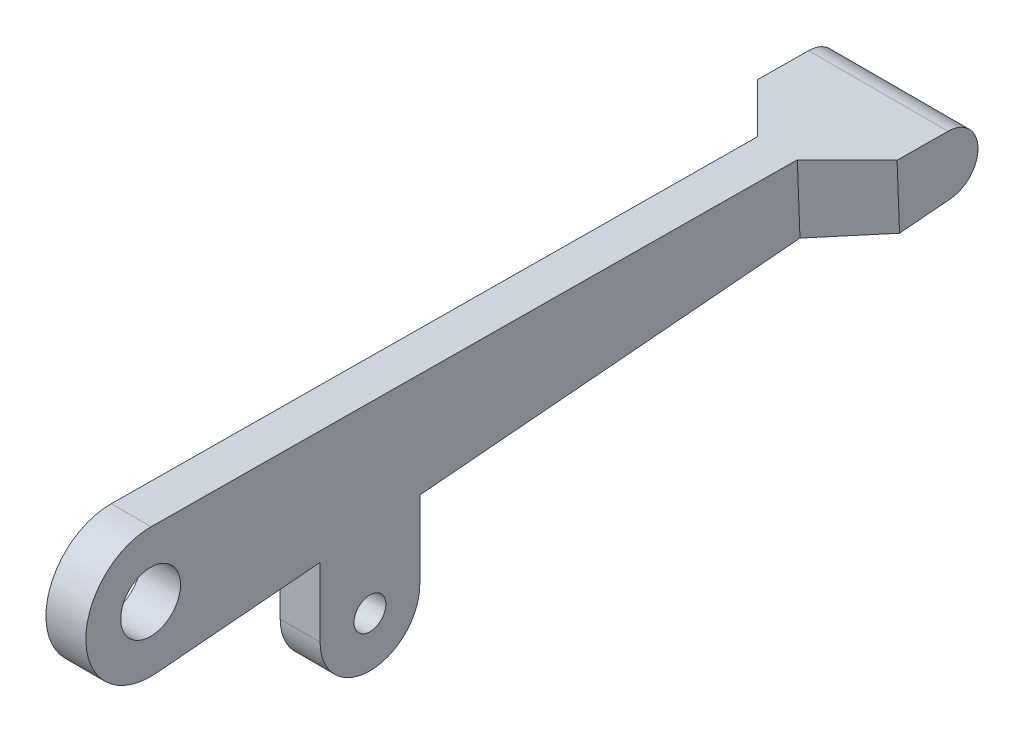
ISO-10303-21;
HEADER;
FILE_DESCRIPTION(('STEP AP214'),'2;1');
FILE_NAME('part.step','',(''),(''),'','','');
FILE_SCHEMA(('AUTOMOTIVE_DESIGN { 1 0 10303 214 1 1 1 1 }'));
ENDSEC;
DATA;
#1=APPLICATION_CONTEXT('core data for automotive mechanical design processes');
#2=APPLICATION_PROTOCOL_DEFINITION('international standard','automotive_design',2000,#1);
#3=PRODUCT_CONTEXT('',#1,'mechanical');
#4=PRODUCT('Part','Part','',(#3));
#5=PRODUCT_RELATED_PRODUCT_CATEGORY('part','',(#4));
#6=PRODUCT_DEFINITION_FORMATION('','',#4);
#7=PRODUCT_DEFINITION_CONTEXT('part definition',#1,'design');
#8=PRODUCT_DEFINITION('design','',#6,#7);
#9=PRODUCT_DEFINITION_SHAPE('','',#8);
#10=(LENGTH_UNIT() NAMED_UNIT(*) SI_UNIT(.MILLI.,.METRE.));
#11=(NAMED_UNIT(*) PLANE_ANGLE_UNIT() SI_UNIT($,.RADIAN.));
#12=(NAMED_UNIT(*) SI_UNIT($,.STERADIAN.) SOLID_ANGLE_UNIT());
#13=UNCERTAINTY_MEASURE_WITH_UNIT(LENGTH_MEASURE(1.E-05),#10,'distance_accuracy_value','');
#14=(GEOMETRIC_REPRESENTATION_CONTEXT(3) GLOBAL_UNCERTAINTY_ASSIGNED_CONTEXT((#13)) GLOBAL_UNIT_ASSIGNED_CONTEXT((#10,
#11,#12)) REPRESENTATION_CONTEXT('',''));
#15=CARTESIAN_POINT('',(0.,0.,0.));
#16=DIRECTION('',(0.,0.,1.));
#17=DIRECTION('',(1.,0.,0.));
#18=AXIS2_PLACEMENT_3D('',#15,#16,#17);
#19=CARTESIAN_POINT('',(4.,0.,0.));
#20=DIRECTION('',(1.,0.,0.));
#21=DIRECTION('',(0.,0.,-1.));
#22=AXIS2_PLACEMENT_3D('',#19,#20,#21);
#23=PLANE('',#22);
#24=DIRECTION('',(0.,0.084979523177334,-0.996382697882974));
#25=VECTOR('',#24,1.);
#26=CARTESIAN_POINT('',(4.,-4.2208208584388,-27.));
#27=LINE('',#26,#25);
#28=CARTESIAN_POINT('',(4.,-4.2208208584388,-27.));
#29=VERTEX_POINT('',#28);
#30=CARTESIAN_POINT('',(4.,-0.967873934352453,-65.1407180354217));
#31=VERTEX_POINT('',#30);
#32=EDGE_CURVE('E215',#29,#31,#27,.T.);
#33=ORIENTED_EDGE('',*,*,#32,.T.);
#34=DIRECTION('',(0.,0.99926154260085,0.0384235537004372));
#35=VECTOR('',#34,1.);
#36=CARTESIAN_POINT('',(4.,5.73385822805701,-64.8830233732634));
#37=LINE('',#36,#35);
#38=CARTESIAN_POINT('',(4.,5.9671075782046,-64.8740544811877));
#39=VERTEX_POINT('',#38);
#40=EDGE_CURVE('E67',#31,#39,#37,.T.);
#41=ORIENTED_EDGE('',*,*,#40,.T.);
#42=DIRECTION('',(0.,0.00821736662322341,0.999966236872915));
#43=VECTOR('',#42,1.);
#44=CARTESIAN_POINT('',(4.,6.49978053967395,-0.0534128830509516));
#45=LINE('',#44,#43);
#46=CARTESIAN_POINT('',(4.,6.49978053967395,-0.0534128830509516));
#47=VERTEX_POINT('',#46);
#48=EDGE_CURVE('E218',#39,#47,#45,.T.);
#49=ORIENTED_EDGE('',*,*,#48,.T.);
#50=CARTESIAN_POINT('',(4.,0.,0.));
#51=DIRECTION('',(1.,0.,0.));
#52=DIRECTION('',(0.,0.,-1.));
#53=AXIS2_PLACEMENT_3D('',#50,#51,#52);
#54=CIRCLE('',#53,6.5);
#55=CARTESIAN_POINT('',(4.,-6.47648753623933,-0.55236690065267));
#56=VERTEX_POINT('',#55);
#57=EDGE_CURVE('E198',#47,#56,#54,.T.);
#58=ORIENTED_EDGE('',*,*,#57,.T.);
#59=DIRECTION('',(0.,0.0849795231773341,-0.996382697882973));
#60=VECTOR('',#59,1.);
#61=CARTESIAN_POINT('',(4.,-6.47648753623933,-0.55236690065267));
#62=LINE('',#61,#60);
#63=CARTESIAN_POINT('',(4.,-5.07370121613561,-17.));
#64=VERTEX_POINT('',#63);
#65=EDGE_CURVE('E202',#56,#64,#62,.T.);
#66=ORIENTED_EDGE('',*,*,#65,.T.);
#67=DIRECTION('',(0.,-1.,0.));
#68=VECTOR('',#67,1.);
#69=CARTESIAN_POINT('',(4.,-12.,-17.));
#70=LINE('',#69,#68);
#71=CARTESIAN_POINT('',(4.,-12.,-17.));
#72=VERTEX_POINT('',#71);
#73=EDGE_CURVE('E206',#64,#72,#70,.T.);
#74=ORIENTED_EDGE('',*,*,#73,.T.);
#75=CARTESIAN_POINT('',(4.,-12.,-22.));
#76=DIRECTION('',(1.,0.,0.));
#77=DIRECTION('',(0.,0.,-1.));
#78=AXIS2_PLACEMENT_3D('',#75,#76,#77);
#79=CIRCLE('',#78,5.);
#80=CARTESIAN_POINT('',(4.,-12.,-27.));
#81=VERTEX_POINT('',#80);
#82=EDGE_CURVE('E209',#72,#81,#79,.T.);
#83=ORIENTED_EDGE('',*,*,#82,.T.);
#84=DIRECTION('',(0.,1.,0.));
#85=VECTOR('',#84,1.);
#86=CARTESIAN_POINT('',(4.,-12.,-27.));
#87=LINE('',#86,#85);
#88=EDGE_CURVE('E212',#81,#29,#87,.T.);
#89=ORIENTED_EDGE('',*,*,#88,.T.);
#90=EDGE_LOOP('',(#33,#41,#49,#58,#66,#74,#83,#89));
#91=FACE_BOUND('',#90,.T.);
#92=CARTESIAN_POINT('',(4.,-12.,-22.));
#93=DIRECTION('',(1.,0.,0.));
#94=DIRECTION('',(0.,0.,-1.));
#95=AXIS2_PLACEMENT_3D('',#92,#93,#94);
#96=CIRCLE('',#95,1.6);
#97=CARTESIAN_POINT('',(4.,-12.,-23.6));
#98=VERTEX_POINT('',#97);
#99=EDGE_CURVE('E190',#98,#98,#96,.T.);
#100=ORIENTED_EDGE('',*,*,#99,.F.);
#101=EDGE_LOOP('',(#100));
#102=FACE_BOUND('',#101,.T.);
#103=CARTESIAN_POINT('',(4.,0.,0.));
#104=DIRECTION('',(1.,0.,0.));
#105=DIRECTION('',(0.,0.,-1.));
#106=AXIS2_PLACEMENT_3D('',#103,#104,#105);
#107=CIRCLE('',#106,3.);
#108=CARTESIAN_POINT('',(4.,0.,-3.));
#109=VERTEX_POINT('',#108);
#110=EDGE_CURVE('E182',#109,#109,#107,.T.);
#111=ORIENTED_EDGE('',*,*,#110,.F.);
#112=EDGE_LOOP('',(#111));
#113=FACE_BOUND('',#112,.T.);
#114=ADVANCED_FACE('F44',(#91,#102,#113),#23,.T.);
#115=CARTESIAN_POINT('',(0.,0.,0.));
#116=DIRECTION('',(1.,0.,0.));
#117=DIRECTION('',(0.,0.,-1.));
#118=AXIS2_PLACEMENT_3D('',#115,#116,#117);
#119=PLANE('',#118);
#120=DIRECTION('',(0.,0.00821736662322341,0.999966236872915));
#121=VECTOR('',#120,1.);
#122=CARTESIAN_POINT('',(0.,6.49978053967395,-0.0534128830509516));
#123=LINE('',#122,#121);
#124=CARTESIAN_POINT('',(0.,5.9671075782046,-64.8740544811876));
#125=VERTEX_POINT('',#124);
#126=CARTESIAN_POINT('',(0.,6.49978053967395,-0.0534128830509516));
#127=VERTEX_POINT('',#126);
#128=EDGE_CURVE('E203',#125,#127,#123,.T.);
#129=ORIENTED_EDGE('',*,*,#128,.F.);
#130=DIRECTION('',(0.,-0.99926154260085,-0.0384235537004372));
#131=VECTOR('',#130,1.);
#132=CARTESIAN_POINT('',(0.,2.49966062498762,-65.0073845739915));
#133=LINE('',#132,#131);
#134=CARTESIAN_POINT('',(0.,-0.96787393435246,-65.1407180354216));
#135=VERTEX_POINT('',#134);
#136=EDGE_CURVE('E267',#125,#135,#133,.T.);
#137=ORIENTED_EDGE('',*,*,#136,.T.);
#138=DIRECTION('',(0.,0.084979523177334,-0.996382697882974));
#139=VECTOR('',#138,1.);
#140=CARTESIAN_POINT('',(0.,-4.2208208584388,-27.));
#141=LINE('',#140,#139);
#142=CARTESIAN_POINT('',(0.,-4.2208208584388,-27.));
#143=VERTEX_POINT('',#142);
#144=EDGE_CURVE('E236',#143,#135,#141,.T.);
#145=ORIENTED_EDGE('',*,*,#144,.F.);
#146=DIRECTION('',(0.,1.,0.));
#147=VECTOR('',#146,1.);
#148=CARTESIAN_POINT('',(0.,-12.,-27.));
#149=LINE('',#148,#147);
#150=CARTESIAN_POINT('',(0.,-12.,-27.));
#151=VERTEX_POINT('',#150);
#152=EDGE_CURVE('E233',#151,#143,#149,.T.);
#153=ORIENTED_EDGE('',*,*,#152,.F.);
#154=CARTESIAN_POINT('',(0.,-12.,-22.));
#155=DIRECTION('',(1.,0.,0.));
#156=DIRECTION('',(0.,0.,-1.));
#157=AXIS2_PLACEMENT_3D('',#154,#155,#156);
#158=CIRCLE('',#157,5.);
#159=CARTESIAN_POINT('',(0.,-12.,-17.));
#160=VERTEX_POINT('',#159);
#161=EDGE_CURVE('E230',#160,#151,#158,.T.);
#162=ORIENTED_EDGE('',*,*,#161,.F.);
#163=DIRECTION('',(0.,-1.,0.));
#164=VECTOR('',#163,1.);
#165=CARTESIAN_POINT('',(0.,-12.,-17.));
#166=LINE('',#165,#164);
#167=CARTESIAN_POINT('',(0.,-5.07370121613561,-17.));
#168=VERTEX_POINT('',#167);
#169=EDGE_CURVE('E227',#168,#160,#166,.T.);
#170=ORIENTED_EDGE('',*,*,#169,.F.);
#171=DIRECTION('',(0.,0.0849795231773341,-0.996382697882973));
#172=VECTOR('',#171,1.);
#173=CARTESIAN_POINT('',(0.,-6.47648753623933,-0.55236690065267));
#174=LINE('',#173,#172);
#175=CARTESIAN_POINT('',(0.,-6.47648753623933,-0.55236690065267));
#176=VERTEX_POINT('',#175);
#177=EDGE_CURVE('E224',#176,#168,#174,.T.);
#178=ORIENTED_EDGE('',*,*,#177,.F.);
#179=CARTESIAN_POINT('',(0.,0.,0.));
#180=DIRECTION('',(1.,0.,0.));
#181=DIRECTION('',(0.,0.,-1.));
#182=AXIS2_PLACEMENT_3D('',#179,#180,#181);
#183=CIRCLE('',#182,6.5);
#184=EDGE_CURVE('E194',#127,#176,#183,.T.);
#185=ORIENTED_EDGE('',*,*,#184,.F.);
#186=EDGE_LOOP('',(#129,#137,#145,#153,#162,#170,#178,#185));
#187=FACE_BOUND('',#186,.T.);
#188=CARTESIAN_POINT('',(0.,-12.,-22.));
#189=DIRECTION('',(1.,0.,0.));
#190=DIRECTION('',(0.,0.,-1.));
#191=AXIS2_PLACEMENT_3D('',#188,#189,#190);
#192=CIRCLE('',#191,1.6);
#193=CARTESIAN_POINT('',(0.,-12.,-23.6));
#194=VERTEX_POINT('',#193);
#195=EDGE_CURVE('E186',#194,#194,#192,.T.);
#196=ORIENTED_EDGE('',*,*,#195,.T.);
#197=EDGE_LOOP('',(#196));
#198=FACE_BOUND('',#197,.T.);
#199=CARTESIAN_POINT('',(0.,0.,0.));
#200=DIRECTION('',(1.,0.,0.));
#201=DIRECTION('',(0.,0.,-1.));
#202=AXIS2_PLACEMENT_3D('',#199,#200,#201);
#203=CIRCLE('',#202,3.);
#204=CARTESIAN_POINT('',(0.,0.,-3.));
#205=VERTEX_POINT('',#204);
#206=EDGE_CURVE('E181',#205,#205,#203,.T.);
#207=ORIENTED_EDGE('',*,*,#206,.T.);
#208=EDGE_LOOP('',(#207));
#209=FACE_BOUND('',#208,.T.);
#210=ADVANCED_FACE('F286',(#187,#198,#209),#119,.F.);
#211=CARTESIAN_POINT('',(4.,0.,0.));
#212=DIRECTION('',(-1.,0.,0.));
#213=DIRECTION('',(0.,0.,1.));
#214=AXIS2_PLACEMENT_3D('',#211,#212,#213);
#215=CYLINDRICAL_SURFACE('',#214,6.5);
#216=ORIENTED_EDGE('',*,*,#184,.T.);
#217=DIRECTION('',(-1.,0.,0.));
#218=VECTOR('',#217,1.);
#219=CARTESIAN_POINT('',(4.,-6.47648753623933,-0.55236690065267));
#220=LINE('',#219,#218);
#221=EDGE_CURVE('E263',#56,#176,#220,.T.);
#222=ORIENTED_EDGE('',*,*,#221,.F.);
#223=ORIENTED_EDGE('',*,*,#57,.F.);
#224=DIRECTION('',(-1.,0.,0.));
#225=VECTOR('',#224,1.);
#226=CARTESIAN_POINT('',(4.,6.49978053967395,-0.0534128830509516));
#227=LINE('',#226,#225);
#228=EDGE_CURVE('E146',#47,#127,#227,.T.);
#229=ORIENTED_EDGE('',*,*,#228,.T.);
#230=EDGE_LOOP('',(#216,#222,#223,#229));
#231=FACE_BOUND('',#230,.T.);
#232=ADVANCED_FACE('F310',(#231),#215,.T.);
#233=CARTESIAN_POINT('',(4.,-6.47648753623933,-0.55236690065267));
#234=DIRECTION('',(0.,0.996382697882974,0.0849795231773341));
#235=DIRECTION('',(0.,-0.0849795231773341,0.996382697882974));
#236=AXIS2_PLACEMENT_3D('',#233,#234,#235);
#237=PLANE('',#236);
#238=ORIENTED_EDGE('',*,*,#177,.T.);
#239=DIRECTION('',(-1.,0.,0.));
#240=VECTOR('',#239,1.);
#241=CARTESIAN_POINT('',(4.,-5.07370121613561,-17.));
#242=LINE('',#241,#240);
#243=EDGE_CURVE('E259',#64,#168,#242,.T.);
#244=ORIENTED_EDGE('',*,*,#243,.F.);
#245=ORIENTED_EDGE('',*,*,#65,.F.);
#246=ORIENTED_EDGE('',*,*,#221,.T.);
#247=EDGE_LOOP('',(#238,#244,#245,#246));
#248=FACE_BOUND('',#247,.T.);
#249=ADVANCED_FACE('F332',(#248),#237,.F.);
#250=CARTESIAN_POINT('',(4.,-12.,-17.));
#251=DIRECTION('',(0.,0.,-1.));
#252=DIRECTION('',(-1.,0.,0.));
#253=AXIS2_PLACEMENT_3D('',#250,#251,#252);
#254=PLANE('',#253);
#255=ORIENTED_EDGE('',*,*,#169,.T.);
#256=DIRECTION('',(-1.,0.,0.));
#257=VECTOR('',#256,1.);
#258=CARTESIAN_POINT('',(4.,-12.,-17.));
#259=LINE('',#258,#257);
#260=EDGE_CURVE('E255',#72,#160,#259,.T.);
#261=ORIENTED_EDGE('',*,*,#260,.F.);
#262=ORIENTED_EDGE('',*,*,#73,.F.);
#263=ORIENTED_EDGE('',*,*,#243,.T.);
#264=EDGE_LOOP('',(#255,#261,#262,#263));
#265=FACE_BOUND('',#264,.T.);
#266=ADVANCED_FACE('F328',(#265),#254,.F.);
#267=CARTESIAN_POINT('',(4.,-12.,-22.));
#268=DIRECTION('',(-1.,0.,0.));
#269=DIRECTION('',(0.,0.,1.));
#270=AXIS2_PLACEMENT_3D('',#267,#268,#269);
#271=CYLINDRICAL_SURFACE('',#270,5.);
#272=ORIENTED_EDGE('',*,*,#161,.T.);
#273=DIRECTION('',(-1.,0.,0.));
#274=VECTOR('',#273,1.);
#275=CARTESIAN_POINT('',(4.,-12.,-27.));
#276=LINE('',#275,#274);
#277=EDGE_CURVE('E251',#81,#151,#276,.T.);
#278=ORIENTED_EDGE('',*,*,#277,.F.);
#279=ORIENTED_EDGE('',*,*,#82,.F.);
#280=ORIENTED_EDGE('',*,*,#260,.T.);
#281=EDGE_LOOP('',(#272,#278,#279,#280));
#282=FACE_BOUND('',#281,.T.);
#283=ADVANCED_FACE('F324',(#282),#271,.T.);
#284=CARTESIAN_POINT('',(4.,-12.,-27.));
#285=DIRECTION('',(0.,0.,1.));
#286=DIRECTION('',(1.,0.,0.));
#287=AXIS2_PLACEMENT_3D('',#284,#285,#286);
#288=PLANE('',#287);
#289=ORIENTED_EDGE('',*,*,#152,.T.);
#290=DIRECTION('',(-1.,0.,0.));
#291=VECTOR('',#290,1.);
#292=CARTESIAN_POINT('',(4.,-4.2208208584388,-27.));
#293=LINE('',#292,#291);
#294=EDGE_CURVE('E247',#29,#143,#293,.T.);
#295=ORIENTED_EDGE('',*,*,#294,.F.);
#296=ORIENTED_EDGE('',*,*,#88,.F.);
#297=ORIENTED_EDGE('',*,*,#277,.T.);
#298=EDGE_LOOP('',(#289,#295,#296,#297));
#299=FACE_BOUND('',#298,.T.);
#300=ADVANCED_FACE('F321',(#299),#288,.F.);
#301=CARTESIAN_POINT('',(4.,-4.2208208584388,-27.));
#302=DIRECTION('',(0.,0.996382697882974,0.084979523177334));
#303=DIRECTION('',(0.,-0.084979523177334,0.996382697882974));
#304=AXIS2_PLACEMENT_3D('',#301,#302,#303);
#305=PLANE('',#304);
#306=ORIENTED_EDGE('',*,*,#144,.T.);
#307=DIRECTION('',(-0.70672184600664,0.0601222909108579,-0.704932296403418));
#308=VECTOR('',#307,1.);
#309=CARTESIAN_POINT('',(21.1374044395483,-2.76607670110695,-44.0568373887795));
#310=LINE('',#309,#308);
#311=CARTESIAN_POINT('',(-5.,-0.542513580412779,-70.1280571164664));
#312=VERTEX_POINT('',#311);
#313=EDGE_CURVE('E273',#135,#312,#310,.T.);
#314=ORIENTED_EDGE('',*,*,#313,.T.);
#315=DIRECTION('',(0.,0.0849795231773341,-0.996382697882974));
#316=VECTOR('',#315,1.);
#317=CARTESIAN_POINT('',(-5.,-0.105251931656809,-75.254938569532));
#318=LINE('',#317,#316);
#319=CARTESIAN_POINT('',(-5.,-0.105251931656809,-75.254938569532));
#320=VERTEX_POINT('',#319);
#321=EDGE_CURVE('E177',#312,#320,#318,.T.);
#322=ORIENTED_EDGE('',*,*,#321,.T.);
#323=DIRECTION('',(-1.,0.,0.));
#324=VECTOR('',#323,1.);
#325=CARTESIAN_POINT('',(4.,-0.105251931656809,-75.254938569532));
#326=LINE('',#325,#324);
#327=CARTESIAN_POINT('',(9.,-0.105251931656809,-75.254938569532));
#328=VERTEX_POINT('',#327);
#329=EDGE_CURVE('E145',#328,#320,#326,.T.);
#330=ORIENTED_EDGE('',*,*,#329,.F.);
#331=DIRECTION('',(0.,0.0849795231773341,-0.996382697882974));
#332=VECTOR('',#331,1.);
#333=CARTESIAN_POINT('',(9.,-0.105251931656809,-75.254938569532));
#334=LINE('',#333,#332);
#335=CARTESIAN_POINT('',(9.,-0.542513580412779,-70.1280571164664));
#336=VERTEX_POINT('',#335);
#337=EDGE_CURVE('E160',#336,#328,#334,.T.);
#338=ORIENTED_EDGE('',*,*,#337,.F.);
#339=DIRECTION('',(0.706721846006648,0.0601222909108572,-0.70493229640341));
#340=VECTOR('',#339,1.);
#341=CARTESIAN_POINT('',(-15.1395813690562,-2.59611775543223,-46.0496016040756));
#342=LINE('',#341,#340);
#343=EDGE_CURVE('E54',#336,#31,#342,.F.);
#344=ORIENTED_EDGE('',*,*,#343,.T.);
#345=ORIENTED_EDGE('',*,*,#32,.F.);
#346=ORIENTED_EDGE('',*,*,#294,.T.);
#347=EDGE_LOOP('',(#306,#314,#322,#330,#338,#344,#345,#346));
#348=FACE_BOUND('',#347,.T.);
#349=ADVANCED_FACE('F291',(#348),#305,.F.);
#350=CARTESIAN_POINT('',(4.,2.88389616199211,-75.));
#351=DIRECTION('',(-1.,0.,0.));
#352=DIRECTION('',(0.,0.,1.));
#353=AXIS2_PLACEMENT_3D('',#350,#351,#352);
#354=CYLINDRICAL_SURFACE('',#353,3.);
#355=ORIENTED_EDGE('',*,*,#329,.T.);
#356=CARTESIAN_POINT('',(-5.,2.88389616199211,-75.));
#357=DIRECTION('',(1.,0.,0.));
#358=DIRECTION('',(0.,0.,1.));
#359=AXIS2_PLACEMENT_3D('',#356,#357,#358);
#360=CIRCLE('',#359,3.);
#361=CARTESIAN_POINT('',(-5.,5.88389616199211,-75.));
#362=VERTEX_POINT('',#361);
#363=EDGE_CURVE('E140',#320,#362,#360,.T.);
#364=ORIENTED_EDGE('',*,*,#363,.T.);
#365=DIRECTION('',(-1.,0.,0.));
#366=VECTOR('',#365,1.);
#367=CARTESIAN_POINT('',(4.,5.88389616199211,-75.));
#368=LINE('',#367,#366);
#369=CARTESIAN_POINT('',(9.,5.88389616199211,-75.));
#370=VERTEX_POINT('',#369);
#371=EDGE_CURVE('E134',#370,#362,#368,.T.);
#372=ORIENTED_EDGE('',*,*,#371,.F.);
#373=CARTESIAN_POINT('',(9.,2.88389616199211,-75.));
#374=DIRECTION('',(1.,0.,0.));
#375=DIRECTION('',(0.,0.,1.));
#376=AXIS2_PLACEMENT_3D('',#373,#374,#375);
#377=CIRCLE('',#376,3.);
#378=EDGE_CURVE('E138',#328,#370,#377,.T.);
#379=ORIENTED_EDGE('',*,*,#378,.F.);
#380=EDGE_LOOP('',(#355,#364,#372,#379));
#381=FACE_BOUND('',#380,.T.);
#382=ADVANCED_FACE('F136',(#381),#354,.T.);
#383=CARTESIAN_POINT('',(4.,6.49978053967395,-0.0534128830509516));
#384=DIRECTION('',(0.,-0.999966236872915,0.00821736662322341));
#385=DIRECTION('',(0.,-0.00821736662322341,-0.999966236872916));
#386=AXIS2_PLACEMENT_3D('',#383,#384,#385);
#387=PLANE('',#386);
#388=ORIENTED_EDGE('',*,*,#48,.F.);
#389=DIRECTION('',(-0.706721823696086,0.00581371727838869,0.707467642089082));
#390=VECTOR('',#389,1.);
#391=CARTESIAN_POINT('',(-28.4113959077634,6.23373397360893,-32.4284541461656));
#392=LINE('',#391,#390);
#393=CARTESIAN_POINT('',(9.,5.9259759965592,-69.8793310862676));
#394=VERTEX_POINT('',#393);
#395=EDGE_CURVE('E11',#39,#394,#392,.F.);
#396=ORIENTED_EDGE('',*,*,#395,.T.);
#397=DIRECTION('',(0.,0.00821736662322346,0.999966236872915));
#398=VECTOR('',#397,1.);
#399=CARTESIAN_POINT('',(9.,5.9259759965592,-69.8793310862676));
#400=LINE('',#399,#398);
#401=EDGE_CURVE('E149',#370,#394,#400,.T.);
#402=ORIENTED_EDGE('',*,*,#401,.F.);
#403=ORIENTED_EDGE('',*,*,#371,.T.);
#404=DIRECTION('',(0.,0.00821736662322346,0.999966236872915));
#405=VECTOR('',#404,1.);
#406=CARTESIAN_POINT('',(-5.,5.9259759965592,-69.8793310862676));
#407=LINE('',#406,#405);
#408=CARTESIAN_POINT('',(-5.,5.9259759965592,-69.8793310862676));
#409=VERTEX_POINT('',#408);
#410=EDGE_CURVE('E170',#362,#409,#407,.T.);
#411=ORIENTED_EDGE('',*,*,#410,.T.);
#412=DIRECTION('',(0.706721823696079,0.00581371727838876,0.707467642089089));
#413=VECTOR('',#412,1.);
#414=CARTESIAN_POINT('',(34.4092188521166,6.25016869711868,-30.4285228572722));
#415=LINE('',#414,#413);
#416=EDGE_CURVE('E276',#409,#125,#415,.T.);
#417=ORIENTED_EDGE('',*,*,#416,.T.);
#418=ORIENTED_EDGE('',*,*,#128,.T.);
#419=ORIENTED_EDGE('',*,*,#228,.F.);
#420=EDGE_LOOP('',(#388,#396,#402,#403,#411,#417,#418,#419));
#421=FACE_BOUND('',#420,.T.);
#422=ADVANCED_FACE('F150',(#421),#387,.F.);
#423=CARTESIAN_POINT('',(4.,-12.,-22.));
#424=DIRECTION('',(-1.,0.,0.));
#425=DIRECTION('',(0.,0.,1.));
#426=AXIS2_PLACEMENT_3D('',#423,#424,#425);
#427=CYLINDRICAL_SURFACE('',#426,1.6);
#428=ORIENTED_EDGE('',*,*,#99,.T.);
#429=EDGE_LOOP('',(#428));
#430=FACE_BOUND('',#429,.T.);
#431=ORIENTED_EDGE('',*,*,#195,.F.);
#432=EDGE_LOOP('',(#431));
#433=FACE_BOUND('',#432,.T.);
#434=ADVANCED_FACE('F302',(#430,#433),#427,.F.);
#435=CARTESIAN_POINT('',(4.,0.,0.));
#436=DIRECTION('',(-1.,0.,0.));
#437=DIRECTION('',(0.,0.,1.));
#438=AXIS2_PLACEMENT_3D('',#435,#436,#437);
#439=CYLINDRICAL_SURFACE('',#438,3.);
#440=ORIENTED_EDGE('',*,*,#110,.T.);
#441=EDGE_LOOP('',(#440));
#442=FACE_BOUND('',#441,.T.);
#443=ORIENTED_EDGE('',*,*,#206,.F.);
#444=EDGE_LOOP('',(#443));
#445=FACE_BOUND('',#444,.T.);
#446=ADVANCED_FACE('F295',(#442,#445),#439,.F.);
#447=CARTESIAN_POINT('',(-5.,2.88389616199211,-75.));
#448=DIRECTION('',(-1.,0.,0.));
#449=DIRECTION('',(0.,0.,1.));
#450=AXIS2_PLACEMENT_3D('',#447,#448,#449);
#451=PLANE('',#450);
#452=ORIENTED_EDGE('',*,*,#363,.F.);
#453=ORIENTED_EDGE('',*,*,#321,.F.);
#454=DIRECTION('',(0.,-0.99926154260085,-0.038423553700437));
#455=VECTOR('',#454,1.);
#456=CARTESIAN_POINT('',(-5.,2.69177839348993,-70.0036922869958));
#457=LINE('',#456,#455);
#458=EDGE_CURVE('E173',#409,#312,#457,.T.);
#459=ORIENTED_EDGE('',*,*,#458,.F.);
#460=ORIENTED_EDGE('',*,*,#410,.F.);
#461=EDGE_LOOP('',(#452,#453,#459,#460));
#462=FACE_BOUND('',#461,.T.);
#463=ADVANCED_FACE('F293',(#462),#451,.T.);
#464=CARTESIAN_POINT('',(9.,2.88389616199211,-75.));
#465=DIRECTION('',(-1.,0.,0.));
#466=DIRECTION('',(0.,0.,1.));
#467=AXIS2_PLACEMENT_3D('',#464,#465,#466);
#468=PLANE('',#467);
#469=ORIENTED_EDGE('',*,*,#378,.T.);
#470=ORIENTED_EDGE('',*,*,#401,.T.);
#471=DIRECTION('',(0.,-0.99926154260085,-0.038423553700437));
#472=VECTOR('',#471,1.);
#473=CARTESIAN_POINT('',(9.,2.69177839348993,-70.0036922869958));
#474=LINE('',#473,#472);
#475=EDGE_CURVE('E156',#394,#336,#474,.T.);
#476=ORIENTED_EDGE('',*,*,#475,.T.);
#477=ORIENTED_EDGE('',*,*,#337,.T.);
#478=EDGE_LOOP('',(#469,#470,#476,#477));
#479=FACE_BOUND('',#478,.T.);
#480=ADVANCED_FACE('F159',(#479),#468,.F.);
#481=CARTESIAN_POINT('',(0.,2.49966062498762,-65.0073845739915));
#482=DIRECTION('',(0.70710678118655,0.0271695553788645,-0.706584612951988));
#483=DIRECTION('',(0.,-0.99926154260085,-0.0384235537004372));
#484=AXIS2_PLACEMENT_3D('',#481,#482,#483);
#485=PLANE('',#484);
#486=ORIENTED_EDGE('',*,*,#416,.F.);
#487=ORIENTED_EDGE('',*,*,#458,.T.);
#488=ORIENTED_EDGE('',*,*,#313,.F.);
#489=ORIENTED_EDGE('',*,*,#136,.F.);
#490=EDGE_LOOP('',(#486,#487,#488,#489));
#491=FACE_BOUND('',#490,.T.);
#492=ADVANCED_FACE('F289',(#491),#485,.F.);
#493=CARTESIAN_POINT('',(9.00000000000002,2.69177839348993,-70.0036922869958));
#494=DIRECTION('',(0.707106781186542,-0.0271695553788648,0.706584612951996));
#495=DIRECTION('',(0.,0.99926154260085,0.0384235537004372));
#496=AXIS2_PLACEMENT_3D('',#493,#494,#495);
#497=PLANE('',#496);
#498=ORIENTED_EDGE('',*,*,#395,.F.);
#499=ORIENTED_EDGE('',*,*,#40,.F.);
#500=ORIENTED_EDGE('',*,*,#343,.F.);
#501=ORIENTED_EDGE('',*,*,#475,.F.);
#502=EDGE_LOOP('',(#498,#499,#500,#501));
#503=FACE_BOUND('',#502,.T.);
#504=ADVANCED_FACE('F47',(#503),#497,.T.);
#505=CLOSED_SHELL('',(#114,#210,#232,#249,#266,#283,#300,#349,#382,#422,#434,#446,#463,#480,
#492,#504));
#506=MANIFOLD_SOLID_BREP('B2',#505);
#507=ADVANCED_BREP_SHAPE_REPRESENTATION('',(#18,#506),#14);
#508=SHAPE_DEFINITION_REPRESENTATION(#9,#507);
ENDSEC;
END-ISO-10303-21;
